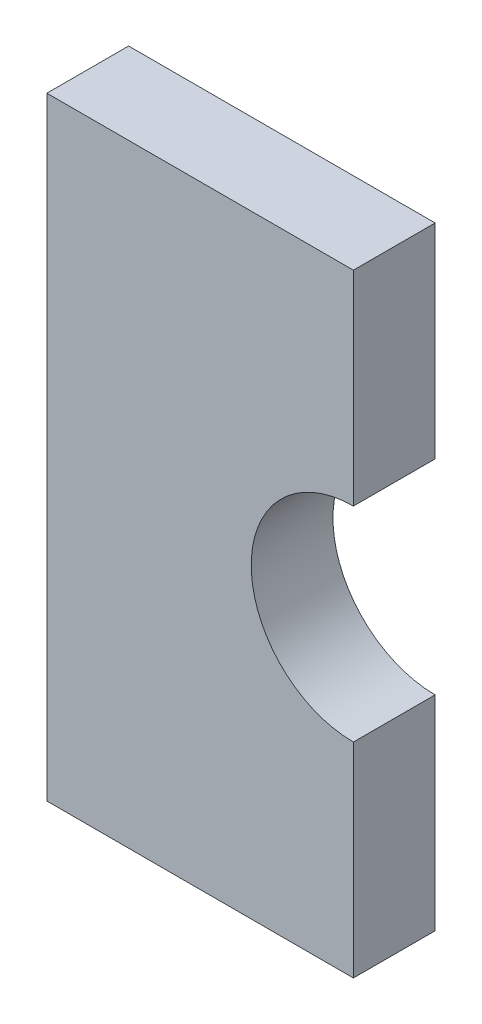
ISO-10303-21;
HEADER;
FILE_DESCRIPTION(('STEP AP214'),'2;1');
FILE_NAME('part.step','',(''),(''),'','','');
FILE_SCHEMA(('AUTOMOTIVE_DESIGN { 1 0 10303 214 1 1 1 1 }'));
ENDSEC;
DATA;
#1=APPLICATION_CONTEXT('core data for automotive mechanical design processes');
#2=APPLICATION_PROTOCOL_DEFINITION('international standard','automotive_design',2000,#1);
#3=PRODUCT_CONTEXT('',#1,'mechanical');
#4=PRODUCT('Part','Part','',(#3));
#5=PRODUCT_RELATED_PRODUCT_CATEGORY('part','',(#4));
#6=PRODUCT_DEFINITION_FORMATION('','',#4);
#7=PRODUCT_DEFINITION_CONTEXT('part definition',#1,'design');
#8=PRODUCT_DEFINITION('design','',#6,#7);
#9=PRODUCT_DEFINITION_SHAPE('','',#8);
#10=(LENGTH_UNIT() NAMED_UNIT(*) SI_UNIT(.MILLI.,.METRE.));
#11=(NAMED_UNIT(*) PLANE_ANGLE_UNIT() SI_UNIT($,.RADIAN.));
#12=(NAMED_UNIT(*) SI_UNIT($,.STERADIAN.) SOLID_ANGLE_UNIT());
#13=UNCERTAINTY_MEASURE_WITH_UNIT(LENGTH_MEASURE(1.E-05),#10,'distance_accuracy_value','');
#14=(GEOMETRIC_REPRESENTATION_CONTEXT(3) GLOBAL_UNCERTAINTY_ASSIGNED_CONTEXT((#13)) GLOBAL_UNIT_ASSIGNED_CONTEXT((#10,
#11,#12)) REPRESENTATION_CONTEXT('',''));
#15=CARTESIAN_POINT('',(0.,0.,0.));
#16=DIRECTION('',(0.,0.,1.));
#17=DIRECTION('',(1.,0.,0.));
#18=AXIS2_PLACEMENT_3D('',#15,#16,#17);
#19=CARTESIAN_POINT('',(0.,0.,4.));
#20=DIRECTION('',(0.,0.,-1.));
#21=DIRECTION('',(-1.,0.,0.));
#22=AXIS2_PLACEMENT_3D('',#19,#20,#21);
#23=CYLINDRICAL_SURFACE('',#22,5.);
#24=CARTESIAN_POINT('',(0.,0.,0.));
#25=DIRECTION('',(0.,0.,-1.));
#26=DIRECTION('',(1.,0.,0.));
#27=AXIS2_PLACEMENT_3D('',#24,#25,#26);
#28=CIRCLE('',#27,5.);
#29=CARTESIAN_POINT('',(0.,-5.,0.));
#30=VERTEX_POINT('',#29);
#31=CARTESIAN_POINT('',(0.,5.,0.));
#32=VERTEX_POINT('',#31);
#33=EDGE_CURVE('E132',#30,#32,#28,.T.);
#34=ORIENTED_EDGE('',*,*,#33,.T.);
#35=DIRECTION('',(0.,0.,-1.));
#36=VECTOR('',#35,1.);
#37=CARTESIAN_POINT('',(0.,5.,4.));
#38=LINE('',#37,#36);
#39=CARTESIAN_POINT('',(0.,5.,4.));
#40=VERTEX_POINT('',#39);
#41=EDGE_CURVE('E11',#40,#32,#38,.T.);
#42=ORIENTED_EDGE('',*,*,#41,.F.);
#43=CARTESIAN_POINT('',(0.,0.,4.));
#44=DIRECTION('',(0.,0.,-1.));
#45=DIRECTION('',(1.,0.,0.));
#46=AXIS2_PLACEMENT_3D('',#43,#44,#45);
#47=CIRCLE('',#46,5.);
#48=CARTESIAN_POINT('',(0.,-5.,4.));
#49=VERTEX_POINT('',#48);
#50=EDGE_CURVE('E148',#49,#40,#47,.T.);
#51=ORIENTED_EDGE('',*,*,#50,.F.);
#52=DIRECTION('',(0.,0.,-1.));
#53=VECTOR('',#52,1.);
#54=CARTESIAN_POINT('',(0.,-5.,4.));
#55=LINE('',#54,#53);
#56=EDGE_CURVE('E128',#49,#30,#55,.T.);
#57=ORIENTED_EDGE('',*,*,#56,.T.);
#58=EDGE_LOOP('',(#34,#42,#51,#57));
#59=FACE_BOUND('',#58,.T.);
#60=ADVANCED_FACE('F43',(#59),#23,.F.);
#61=CARTESIAN_POINT('',(0.,5.,4.));
#62=DIRECTION('',(-1.,0.,0.));
#63=DIRECTION('',(0.,0.,1.));
#64=AXIS2_PLACEMENT_3D('',#61,#62,#63);
#65=PLANE('',#64);
#66=DIRECTION('',(0.,1.,0.));
#67=VECTOR('',#66,1.);
#68=CARTESIAN_POINT('',(0.,5.,0.));
#69=LINE('',#68,#67);
#70=CARTESIAN_POINT('',(0.,15.,0.));
#71=VERTEX_POINT('',#70);
#72=EDGE_CURVE('E136',#32,#71,#69,.T.);
#73=ORIENTED_EDGE('',*,*,#72,.T.);
#74=DIRECTION('',(0.,0.,-1.));
#75=VECTOR('',#74,1.);
#76=CARTESIAN_POINT('',(0.,15.,4.));
#77=LINE('',#76,#75);
#78=CARTESIAN_POINT('',(0.,15.,4.));
#79=VERTEX_POINT('',#78);
#80=EDGE_CURVE('E52',#79,#71,#77,.T.);
#81=ORIENTED_EDGE('',*,*,#80,.F.);
#82=DIRECTION('',(0.,1.,0.));
#83=VECTOR('',#82,1.);
#84=CARTESIAN_POINT('',(0.,5.,4.));
#85=LINE('',#84,#83);
#86=EDGE_CURVE('E97',#40,#79,#85,.T.);
#87=ORIENTED_EDGE('',*,*,#86,.F.);
#88=ORIENTED_EDGE('',*,*,#41,.T.);
#89=EDGE_LOOP('',(#73,#81,#87,#88));
#90=FACE_BOUND('',#89,.T.);
#91=ADVANCED_FACE('F176',(#90),#65,.F.);
#92=CARTESIAN_POINT('',(0.,15.,4.));
#93=DIRECTION('',(0.,-1.,0.));
#94=DIRECTION('',(1.,0.,0.));
#95=AXIS2_PLACEMENT_3D('',#92,#93,#94);
#96=PLANE('',#95);
#97=DIRECTION('',(-1.,0.,0.));
#98=VECTOR('',#97,1.);
#99=CARTESIAN_POINT('',(0.,15.,0.));
#100=LINE('',#99,#98);
#101=CARTESIAN_POINT('',(-15.,15.,0.));
#102=VERTEX_POINT('',#101);
#103=EDGE_CURVE('E139',#71,#102,#100,.T.);
#104=ORIENTED_EDGE('',*,*,#103,.T.);
#105=DIRECTION('',(0.,0.,-1.));
#106=VECTOR('',#105,1.);
#107=CARTESIAN_POINT('',(-15.,15.,4.));
#108=LINE('',#107,#106);
#109=CARTESIAN_POINT('',(-15.,15.,4.));
#110=VERTEX_POINT('',#109);
#111=EDGE_CURVE('E121',#110,#102,#108,.T.);
#112=ORIENTED_EDGE('',*,*,#111,.F.);
#113=DIRECTION('',(-1.,0.,0.));
#114=VECTOR('',#113,1.);
#115=CARTESIAN_POINT('',(0.,15.,4.));
#116=LINE('',#115,#114);
#117=EDGE_CURVE('E110',#79,#110,#116,.T.);
#118=ORIENTED_EDGE('',*,*,#117,.F.);
#119=ORIENTED_EDGE('',*,*,#80,.T.);
#120=EDGE_LOOP('',(#104,#112,#118,#119));
#121=FACE_BOUND('',#120,.T.);
#122=ADVANCED_FACE('F158',(#121),#96,.F.);
#123=CARTESIAN_POINT('',(-15.,15.,4.));
#124=DIRECTION('',(1.,0.,0.));
#125=DIRECTION('',(0.,0.,-1.));
#126=AXIS2_PLACEMENT_3D('',#123,#124,#125);
#127=PLANE('',#126);
#128=DIRECTION('',(0.,-1.,0.));
#129=VECTOR('',#128,1.);
#130=CARTESIAN_POINT('',(-15.,15.,0.));
#131=LINE('',#130,#129);
#132=CARTESIAN_POINT('',(-15.,-15.,0.));
#133=VERTEX_POINT('',#132);
#134=EDGE_CURVE('E119',#102,#133,#131,.T.);
#135=ORIENTED_EDGE('',*,*,#134,.T.);
#136=DIRECTION('',(0.,0.,-1.));
#137=VECTOR('',#136,1.);
#138=CARTESIAN_POINT('',(-15.,-15.,4.));
#139=LINE('',#138,#137);
#140=CARTESIAN_POINT('',(-15.,-15.,4.));
#141=VERTEX_POINT('',#140);
#142=EDGE_CURVE('E116',#141,#133,#139,.T.);
#143=ORIENTED_EDGE('',*,*,#142,.F.);
#144=DIRECTION('',(0.,-1.,0.));
#145=VECTOR('',#144,1.);
#146=CARTESIAN_POINT('',(-15.,15.,4.));
#147=LINE('',#146,#145);
#148=EDGE_CURVE('E104',#110,#141,#147,.T.);
#149=ORIENTED_EDGE('',*,*,#148,.F.);
#150=ORIENTED_EDGE('',*,*,#111,.T.);
#151=EDGE_LOOP('',(#135,#143,#149,#150));
#152=FACE_BOUND('',#151,.T.);
#153=ADVANCED_FACE('F117',(#152),#127,.F.);
#154=CARTESIAN_POINT('',(-15.,-15.,4.));
#155=DIRECTION('',(0.,1.,0.));
#156=DIRECTION('',(0.,0.,1.));
#157=AXIS2_PLACEMENT_3D('',#154,#155,#156);
#158=PLANE('',#157);
#159=DIRECTION('',(1.,0.,0.));
#160=VECTOR('',#159,1.);
#161=CARTESIAN_POINT('',(-15.,-15.,0.));
#162=LINE('',#161,#160);
#163=CARTESIAN_POINT('',(0.,-15.,0.));
#164=VERTEX_POINT('',#163);
#165=EDGE_CURVE('E83',#133,#164,#162,.T.);
#166=ORIENTED_EDGE('',*,*,#165,.T.);
#167=DIRECTION('',(0.,0.,-1.));
#168=VECTOR('',#167,1.);
#169=CARTESIAN_POINT('',(0.,-15.,4.));
#170=LINE('',#169,#168);
#171=CARTESIAN_POINT('',(0.,-15.,4.));
#172=VERTEX_POINT('',#171);
#173=EDGE_CURVE('E122',#172,#164,#170,.T.);
#174=ORIENTED_EDGE('',*,*,#173,.F.);
#175=DIRECTION('',(1.,0.,0.));
#176=VECTOR('',#175,1.);
#177=CARTESIAN_POINT('',(-15.,-15.,4.));
#178=LINE('',#177,#176);
#179=EDGE_CURVE('E108',#141,#172,#178,.T.);
#180=ORIENTED_EDGE('',*,*,#179,.F.);
#181=ORIENTED_EDGE('',*,*,#142,.T.);
#182=EDGE_LOOP('',(#166,#174,#180,#181));
#183=FACE_BOUND('',#182,.T.);
#184=ADVANCED_FACE('F124',(#183),#158,.F.);
#185=CARTESIAN_POINT('',(0.,-15.,4.));
#186=DIRECTION('',(-1.,0.,0.));
#187=DIRECTION('',(0.,0.,1.));
#188=AXIS2_PLACEMENT_3D('',#185,#186,#187);
#189=PLANE('',#188);
#190=DIRECTION('',(0.,1.,0.));
#191=VECTOR('',#190,1.);
#192=CARTESIAN_POINT('',(0.,-15.,0.));
#193=LINE('',#192,#191);
#194=EDGE_CURVE('E89',#164,#30,#193,.T.);
#195=ORIENTED_EDGE('',*,*,#194,.T.);
#196=ORIENTED_EDGE('',*,*,#56,.F.);
#197=DIRECTION('',(0.,1.,0.));
#198=VECTOR('',#197,1.);
#199=CARTESIAN_POINT('',(0.,-15.,4.));
#200=LINE('',#199,#198);
#201=EDGE_CURVE('E60',#172,#49,#200,.T.);
#202=ORIENTED_EDGE('',*,*,#201,.F.);
#203=ORIENTED_EDGE('',*,*,#173,.T.);
#204=EDGE_LOOP('',(#195,#196,#202,#203));
#205=FACE_BOUND('',#204,.T.);
#206=ADVANCED_FACE('F165',(#205),#189,.F.);
#207=CARTESIAN_POINT('',(0.,0.,4.));
#208=DIRECTION('',(0.,0.,1.));
#209=DIRECTION('',(1.,0.,0.));
#210=AXIS2_PLACEMENT_3D('',#207,#208,#209);
#211=PLANE('',#210);
#212=ORIENTED_EDGE('',*,*,#50,.T.);
#213=ORIENTED_EDGE('',*,*,#86,.T.);
#214=ORIENTED_EDGE('',*,*,#117,.T.);
#215=ORIENTED_EDGE('',*,*,#148,.T.);
#216=ORIENTED_EDGE('',*,*,#179,.T.);
#217=ORIENTED_EDGE('',*,*,#201,.T.);
#218=EDGE_LOOP('',(#212,#213,#214,#215,#216,#217));
#219=FACE_BOUND('',#218,.T.);
#220=ADVANCED_FACE('F106',(#219),#211,.T.);
#221=CARTESIAN_POINT('',(0.,0.,0.));
#222=DIRECTION('',(0.,0.,1.));
#223=DIRECTION('',(1.,0.,0.));
#224=AXIS2_PLACEMENT_3D('',#221,#222,#223);
#225=PLANE('',#224);
#226=ORIENTED_EDGE('',*,*,#33,.F.);
#227=ORIENTED_EDGE('',*,*,#194,.F.);
#228=ORIENTED_EDGE('',*,*,#165,.F.);
#229=ORIENTED_EDGE('',*,*,#134,.F.);
#230=ORIENTED_EDGE('',*,*,#103,.F.);
#231=ORIENTED_EDGE('',*,*,#72,.F.);
#232=EDGE_LOOP('',(#226,#227,#228,#229,#230,#231));
#233=FACE_BOUND('',#232,.T.);
#234=ADVANCED_FACE('F161',(#233),#225,.F.);
#235=CLOSED_SHELL('',(#60,#91,#122,#153,#184,#206,#220,#234));
#236=MANIFOLD_SOLID_BREP('B2',#235);
#237=ADVANCED_BREP_SHAPE_REPRESENTATION('',(#18,#236),#14);
#238=SHAPE_DEFINITION_REPRESENTATION(#9,#237);
ENDSEC;
END-ISO-10303-21;
